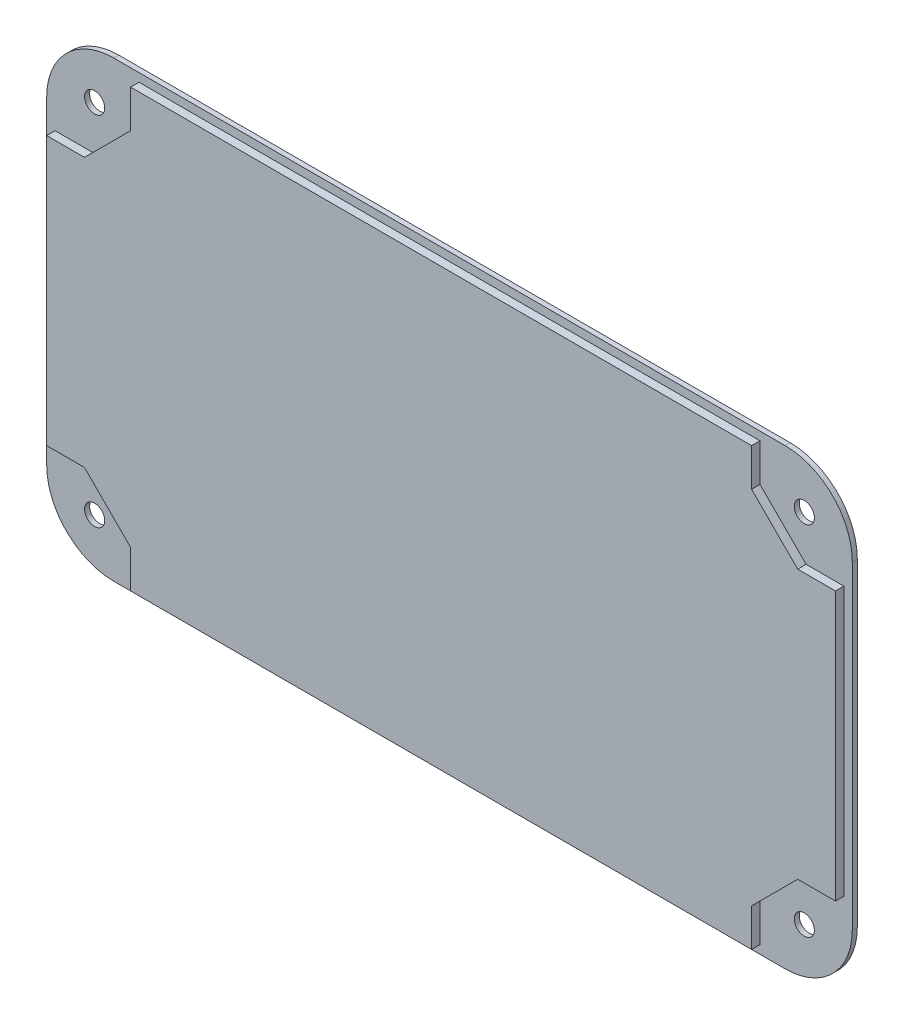
ISO-10303-21;
HEADER;
FILE_DESCRIPTION(('STEP AP214'),'2;1');
FILE_NAME('part.step','',(''),(''),'','','');
FILE_SCHEMA(('AUTOMOTIVE_DESIGN { 1 0 10303 214 1 1 1 1 }'));
ENDSEC;
DATA;
#1=APPLICATION_CONTEXT('core data for automotive mechanical design processes');
#2=APPLICATION_PROTOCOL_DEFINITION('international standard','automotive_design',2000,#1);
#3=PRODUCT_CONTEXT('',#1,'mechanical');
#4=PRODUCT('Part','Part','',(#3));
#5=PRODUCT_RELATED_PRODUCT_CATEGORY('part','',(#4));
#6=PRODUCT_DEFINITION_FORMATION('','',#4);
#7=PRODUCT_DEFINITION_CONTEXT('part definition',#1,'design');
#8=PRODUCT_DEFINITION('design','',#6,#7);
#9=PRODUCT_DEFINITION_SHAPE('','',#8);
#10=(LENGTH_UNIT() NAMED_UNIT(*) SI_UNIT(.MILLI.,.METRE.));
#11=(NAMED_UNIT(*) PLANE_ANGLE_UNIT() SI_UNIT($,.RADIAN.));
#12=(NAMED_UNIT(*) SI_UNIT($,.STERADIAN.) SOLID_ANGLE_UNIT());
#13=UNCERTAINTY_MEASURE_WITH_UNIT(LENGTH_MEASURE(1.E-05),#10,'distance_accuracy_value','');
#14=(GEOMETRIC_REPRESENTATION_CONTEXT(3) GLOBAL_UNCERTAINTY_ASSIGNED_CONTEXT((#13)) GLOBAL_UNIT_ASSIGNED_CONTEXT((#10,
#11,#12)) REPRESENTATION_CONTEXT('',''));
#15=CARTESIAN_POINT('',(0.,0.,0.));
#16=DIRECTION('',(0.,0.,1.));
#17=DIRECTION('',(1.,0.,0.));
#18=AXIS2_PLACEMENT_3D('',#15,#16,#17);
#19=CARTESIAN_POINT('',(100.,-47.5,1.5));
#20=DIRECTION('',(0.,0.,1.));
#21=DIRECTION('',(1.,0.,0.));
#22=AXIS2_PLACEMENT_3D('',#19,#20,#21);
#23=PLANE('',#22);
#24=CARTESIAN_POINT('',(-105.710599836322,53.2105998363216,1.5));
#25=DIRECTION('',(0.,0.,1.));
#26=DIRECTION('',(1.,0.,0.));
#27=AXIS2_PLACEMENT_3D('',#24,#25,#26);
#28=CIRCLE('',#27,3.00000000000001);
#29=CARTESIAN_POINT('',(-102.710599836322,53.2105998363216,1.5));
#30=VERTEX_POINT('',#29);
#31=EDGE_CURVE('E149',#30,#30,#28,.T.);
#32=ORIENTED_EDGE('',*,*,#31,.F.);
#33=EDGE_LOOP('',(#32));
#34=FACE_BOUND('',#33,.T.);
#35=CARTESIAN_POINT('',(-105.710599836322,-53.2105998363216,1.5));
#36=DIRECTION('',(0.,0.,1.));
#37=DIRECTION('',(1.,0.,0.));
#38=AXIS2_PLACEMENT_3D('',#35,#36,#37);
#39=CIRCLE('',#38,3.00000000000002);
#40=CARTESIAN_POINT('',(-102.710599836322,-53.2105998363216,1.5));
#41=VERTEX_POINT('',#40);
#42=EDGE_CURVE('E196',#41,#41,#39,.T.);
#43=ORIENTED_EDGE('',*,*,#42,.F.);
#44=EDGE_LOOP('',(#43));
#45=FACE_BOUND('',#44,.T.);
#46=CARTESIAN_POINT('',(105.710599836322,-53.2105998363216,1.5));
#47=DIRECTION('',(0.,0.,1.));
#48=DIRECTION('',(1.,0.,0.));
#49=AXIS2_PLACEMENT_3D('',#46,#47,#48);
#50=CIRCLE('',#49,3.00000000000004);
#51=CARTESIAN_POINT('',(108.710599836322,-53.2105998363216,1.5));
#52=VERTEX_POINT('',#51);
#53=EDGE_CURVE('E199',#52,#52,#50,.T.);
#54=ORIENTED_EDGE('',*,*,#53,.F.);
#55=EDGE_LOOP('',(#54));
#56=FACE_BOUND('',#55,.T.);
#57=CARTESIAN_POINT('',(105.710599836322,53.2105998363216,1.5));
#58=DIRECTION('',(0.,0.,1.));
#59=DIRECTION('',(1.,0.,0.));
#60=AXIS2_PLACEMENT_3D('',#57,#58,#59);
#61=CIRCLE('',#60,3.00000000000001);
#62=CARTESIAN_POINT('',(108.710599836322,53.2105998363216,1.5));
#63=VERTEX_POINT('',#62);
#64=EDGE_CURVE('E202',#63,#63,#61,.T.);
#65=ORIENTED_EDGE('',*,*,#64,.F.);
#66=EDGE_LOOP('',(#65));
#67=FACE_BOUND('',#66,.T.);
#68=CARTESIAN_POINT('',(100.,-47.5,1.5));
#69=DIRECTION('',(0.,0.,1.));
#70=DIRECTION('',(1.,0.,0.));
#71=AXIS2_PLACEMENT_3D('',#68,#69,#70);
#72=CIRCLE('',#71,20.);
#73=CARTESIAN_POINT('',(99.9999999999998,-67.5,1.5));
#74=VERTEX_POINT('',#73);
#75=CARTESIAN_POINT('',(120.,-47.4999999999999,1.5));
#76=VERTEX_POINT('',#75);
#77=EDGE_CURVE('E161',#74,#76,#72,.T.);
#78=ORIENTED_EDGE('',*,*,#77,.T.);
#79=DIRECTION('',(0.,1.,0.));
#80=VECTOR('',#79,1.);
#81=CARTESIAN_POINT('',(120.,-47.4999999999999,1.5));
#82=LINE('',#81,#80);
#83=CARTESIAN_POINT('',(120.,47.4999999999999,1.5));
#84=VERTEX_POINT('',#83);
#85=EDGE_CURVE('E101',#76,#84,#82,.T.);
#86=ORIENTED_EDGE('',*,*,#85,.T.);
#87=CARTESIAN_POINT('',(100.,47.5,1.5));
#88=DIRECTION('',(0.,0.,1.));
#89=DIRECTION('',(-1.,0.,0.));
#90=AXIS2_PLACEMENT_3D('',#87,#88,#89);
#91=CIRCLE('',#90,20.);
#92=CARTESIAN_POINT('',(99.9999999999998,67.5,1.5));
#93=VERTEX_POINT('',#92);
#94=EDGE_CURVE('E176',#84,#93,#91,.T.);
#95=ORIENTED_EDGE('',*,*,#94,.T.);
#96=DIRECTION('',(-1.,0.,0.));
#97=VECTOR('',#96,1.);
#98=CARTESIAN_POINT('',(-99.9999999999999,67.5,1.5));
#99=LINE('',#98,#97);
#100=CARTESIAN_POINT('',(-99.9999999999999,67.5,1.5));
#101=VERTEX_POINT('',#100);
#102=EDGE_CURVE('E188',#93,#101,#99,.T.);
#103=ORIENTED_EDGE('',*,*,#102,.T.);
#104=CARTESIAN_POINT('',(-100.,47.5,1.5));
#105=DIRECTION('',(0.,0.,1.));
#106=DIRECTION('',(-1.,0.,0.));
#107=AXIS2_PLACEMENT_3D('',#104,#105,#106);
#108=CIRCLE('',#107,20.);
#109=CARTESIAN_POINT('',(-120.,47.4999999999999,1.5));
#110=VERTEX_POINT('',#109);
#111=EDGE_CURVE('E124',#101,#110,#108,.T.);
#112=ORIENTED_EDGE('',*,*,#111,.T.);
#113=DIRECTION('',(0.,-1.,0.));
#114=VECTOR('',#113,1.);
#115=CARTESIAN_POINT('',(-120.,-47.4999999999999,1.5));
#116=LINE('',#115,#114);
#117=CARTESIAN_POINT('',(-120.,-47.5,1.5));
#118=VERTEX_POINT('',#117);
#119=EDGE_CURVE('E117',#110,#118,#116,.T.);
#120=ORIENTED_EDGE('',*,*,#119,.T.);
#121=CARTESIAN_POINT('',(-100.,-47.5,1.5));
#122=DIRECTION('',(0.,0.,1.));
#123=DIRECTION('',(-1.,0.,0.));
#124=AXIS2_PLACEMENT_3D('',#121,#122,#123);
#125=CIRCLE('',#124,20.);
#126=CARTESIAN_POINT('',(-99.9999999999999,-67.5,1.5));
#127=VERTEX_POINT('',#126);
#128=EDGE_CURVE('E121',#118,#127,#125,.T.);
#129=ORIENTED_EDGE('',*,*,#128,.T.);
#130=DIRECTION('',(1.,0.,0.));
#131=VECTOR('',#130,1.);
#132=CARTESIAN_POINT('',(-99.9999999999999,-67.5,1.5));
#133=LINE('',#132,#131);
#134=EDGE_CURVE('E60',#127,#74,#133,.T.);
#135=ORIENTED_EDGE('',*,*,#134,.T.);
#136=EDGE_LOOP('',(#78,#86,#95,#103,#112,#120,#129,#135));
#137=FACE_BOUND('',#136,.T.);
#138=DIRECTION('',(0.,-1.,0.));
#139=VECTOR('',#138,1.);
#140=CARTESIAN_POINT('',(-92.5,0.,1.5));
#141=LINE('',#140,#139);
#142=CARTESIAN_POINT('',(-92.5,-53.75,1.5));
#143=VERTEX_POINT('',#142);
#144=CARTESIAN_POINT('',(-92.5,-65.,1.5));
#145=VERTEX_POINT('',#144);
#146=EDGE_CURVE('E305',#143,#145,#141,.T.);
#147=ORIENTED_EDGE('',*,*,#146,.F.);
#148=DIRECTION('',(0.707106781186547,-0.707106781186548,0.));
#149=VECTOR('',#148,1.);
#150=CARTESIAN_POINT('',(-73.125,-73.125,1.5));
#151=LINE('',#150,#149);
#152=CARTESIAN_POINT('',(-106.25,-40.,1.5));
#153=VERTEX_POINT('',#152);
#154=EDGE_CURVE('E308',#153,#143,#151,.T.);
#155=ORIENTED_EDGE('',*,*,#154,.F.);
#156=DIRECTION('',(1.,0.,0.));
#157=VECTOR('',#156,1.);
#158=CARTESIAN_POINT('',(0.,-40.,1.5));
#159=LINE('',#158,#157);
#160=CARTESIAN_POINT('',(-117.5,-40.,1.5));
#161=VERTEX_POINT('',#160);
#162=EDGE_CURVE('E264',#161,#153,#159,.T.);
#163=ORIENTED_EDGE('',*,*,#162,.F.);
#164=DIRECTION('',(0.,-1.,0.));
#165=VECTOR('',#164,1.);
#166=CARTESIAN_POINT('',(-117.5,0.,1.5));
#167=LINE('',#166,#165);
#168=CARTESIAN_POINT('',(-117.5,40.,1.5));
#169=VERTEX_POINT('',#168);
#170=EDGE_CURVE('E267',#169,#161,#167,.T.);
#171=ORIENTED_EDGE('',*,*,#170,.F.);
#172=DIRECTION('',(-1.,0.,0.));
#173=VECTOR('',#172,1.);
#174=CARTESIAN_POINT('',(0.,40.,1.5));
#175=LINE('',#174,#173);
#176=CARTESIAN_POINT('',(-106.25,40.,1.5));
#177=VERTEX_POINT('',#176);
#178=EDGE_CURVE('E269',#177,#169,#175,.T.);
#179=ORIENTED_EDGE('',*,*,#178,.F.);
#180=DIRECTION('',(-0.707106781186548,-0.707106781186548,0.));
#181=VECTOR('',#180,1.);
#182=CARTESIAN_POINT('',(-73.125,73.125,1.5));
#183=LINE('',#182,#181);
#184=CARTESIAN_POINT('',(-92.5,53.75,1.5));
#185=VERTEX_POINT('',#184);
#186=EDGE_CURVE('E272',#185,#177,#183,.T.);
#187=ORIENTED_EDGE('',*,*,#186,.F.);
#188=DIRECTION('',(0.,-1.,0.));
#189=VECTOR('',#188,1.);
#190=CARTESIAN_POINT('',(-92.5,0.,1.5));
#191=LINE('',#190,#189);
#192=CARTESIAN_POINT('',(-92.5,65.,1.5));
#193=VERTEX_POINT('',#192);
#194=EDGE_CURVE('E275',#193,#185,#191,.T.);
#195=ORIENTED_EDGE('',*,*,#194,.F.);
#196=DIRECTION('',(-1.,0.,0.));
#197=VECTOR('',#196,1.);
#198=CARTESIAN_POINT('',(0.,65.,1.5));
#199=LINE('',#198,#197);
#200=CARTESIAN_POINT('',(92.4999999999999,65.,1.5));
#201=VERTEX_POINT('',#200);
#202=EDGE_CURVE('E278',#201,#193,#199,.T.);
#203=ORIENTED_EDGE('',*,*,#202,.F.);
#204=DIRECTION('',(0.,1.,0.));
#205=VECTOR('',#204,1.);
#206=CARTESIAN_POINT('',(92.4999999999999,0.,1.5));
#207=LINE('',#206,#205);
#208=CARTESIAN_POINT('',(92.4999999999999,53.75,1.5));
#209=VERTEX_POINT('',#208);
#210=EDGE_CURVE('E281',#209,#201,#207,.T.);
#211=ORIENTED_EDGE('',*,*,#210,.F.);
#212=DIRECTION('',(-0.707106781186548,0.707106781186547,0.));
#213=VECTOR('',#212,1.);
#214=CARTESIAN_POINT('',(73.1249999999999,73.125,1.5));
#215=LINE('',#214,#213);
#216=CARTESIAN_POINT('',(106.25,40.,1.5));
#217=VERTEX_POINT('',#216);
#218=EDGE_CURVE('E284',#217,#209,#215,.T.);
#219=ORIENTED_EDGE('',*,*,#218,.F.);
#220=DIRECTION('',(-1.,0.,0.));
#221=VECTOR('',#220,1.);
#222=CARTESIAN_POINT('',(0.,40.0000000000003,1.5));
#223=LINE('',#222,#221);
#224=CARTESIAN_POINT('',(117.5,40.,1.5));
#225=VERTEX_POINT('',#224);
#226=EDGE_CURVE('E287',#225,#217,#223,.T.);
#227=ORIENTED_EDGE('',*,*,#226,.F.);
#228=DIRECTION('',(0.,1.,0.));
#229=VECTOR('',#228,1.);
#230=CARTESIAN_POINT('',(117.5,0.,1.5));
#231=LINE('',#230,#229);
#232=CARTESIAN_POINT('',(117.5,-40.,1.5));
#233=VERTEX_POINT('',#232);
#234=EDGE_CURVE('E290',#233,#225,#231,.T.);
#235=ORIENTED_EDGE('',*,*,#234,.F.);
#236=DIRECTION('',(1.,0.,0.));
#237=VECTOR('',#236,1.);
#238=CARTESIAN_POINT('',(0.,-40.,1.5));
#239=LINE('',#238,#237);
#240=CARTESIAN_POINT('',(106.25,-40.,1.5));
#241=VERTEX_POINT('',#240);
#242=EDGE_CURVE('E293',#241,#233,#239,.T.);
#243=ORIENTED_EDGE('',*,*,#242,.F.);
#244=DIRECTION('',(0.707106781186548,0.707106781186547,0.));
#245=VECTOR('',#244,1.);
#246=CARTESIAN_POINT('',(73.1249999999999,-73.125,1.5));
#247=LINE('',#246,#245);
#248=CARTESIAN_POINT('',(92.4999999999999,-53.75,1.5));
#249=VERTEX_POINT('',#248);
#250=EDGE_CURVE('E296',#249,#241,#247,.T.);
#251=ORIENTED_EDGE('',*,*,#250,.F.);
#252=DIRECTION('',(0.,1.,0.));
#253=VECTOR('',#252,1.);
#254=CARTESIAN_POINT('',(92.4999999999999,0.,1.5));
#255=LINE('',#254,#253);
#256=CARTESIAN_POINT('',(92.4999999999999,-65.,1.5));
#257=VERTEX_POINT('',#256);
#258=EDGE_CURVE('E299',#257,#249,#255,.T.);
#259=ORIENTED_EDGE('',*,*,#258,.F.);
#260=DIRECTION('',(1.,0.,0.));
#261=VECTOR('',#260,1.);
#262=CARTESIAN_POINT('',(0.,-65.,1.5));
#263=LINE('',#262,#261);
#264=EDGE_CURVE('E302',#145,#257,#263,.T.);
#265=ORIENTED_EDGE('',*,*,#264,.F.);
#266=EDGE_LOOP('',(#147,#155,#163,#171,#179,#187,#195,#203,#211,#219,#227,#235,#243,#251,#259,#265));
#267=FACE_BOUND('',#266,.T.);
#268=ADVANCED_FACE('F36',(#34,#45,#56,#67,#137,#267),#23,.T.);
#269=CARTESIAN_POINT('',(100.,-47.5,1.5));
#270=DIRECTION('',(0.,0.,-1.));
#271=DIRECTION('',(-1.,0.,0.));
#272=AXIS2_PLACEMENT_3D('',#269,#270,#271);
#273=CYLINDRICAL_SURFACE('',#272,20.);
#274=CARTESIAN_POINT('',(100.,-47.5,0.));
#275=DIRECTION('',(0.,0.,1.));
#276=DIRECTION('',(1.,0.,0.));
#277=AXIS2_PLACEMENT_3D('',#274,#275,#276);
#278=CIRCLE('',#277,20.);
#279=CARTESIAN_POINT('',(99.9999999999998,-67.5,0.));
#280=VERTEX_POINT('',#279);
#281=CARTESIAN_POINT('',(120.,-47.4999999999999,0.));
#282=VERTEX_POINT('',#281);
#283=EDGE_CURVE('E145',#280,#282,#278,.T.);
#284=ORIENTED_EDGE('',*,*,#283,.T.);
#285=DIRECTION('',(0.,0.,-1.));
#286=VECTOR('',#285,1.);
#287=CARTESIAN_POINT('',(120.,-47.4999999999999,1.5));
#288=LINE('',#287,#286);
#289=EDGE_CURVE('E11',#76,#282,#288,.T.);
#290=ORIENTED_EDGE('',*,*,#289,.F.);
#291=ORIENTED_EDGE('',*,*,#77,.F.);
#292=DIRECTION('',(0.,0.,-1.));
#293=VECTOR('',#292,1.);
#294=CARTESIAN_POINT('',(99.9999999999998,-67.5,1.5));
#295=LINE('',#294,#293);
#296=EDGE_CURVE('E141',#74,#280,#295,.T.);
#297=ORIENTED_EDGE('',*,*,#296,.T.);
#298=EDGE_LOOP('',(#284,#290,#291,#297));
#299=FACE_BOUND('',#298,.T.);
#300=ADVANCED_FACE('F38',(#299),#273,.T.);
#301=CARTESIAN_POINT('',(120.,-47.4999999999999,1.5));
#302=DIRECTION('',(-1.,0.,0.));
#303=DIRECTION('',(0.,0.,1.));
#304=AXIS2_PLACEMENT_3D('',#301,#302,#303);
#305=PLANE('',#304);
#306=DIRECTION('',(0.,1.,0.));
#307=VECTOR('',#306,1.);
#308=CARTESIAN_POINT('',(120.,-47.4999999999999,0.));
#309=LINE('',#308,#307);
#310=CARTESIAN_POINT('',(120.,47.4999999999999,0.));
#311=VERTEX_POINT('',#310);
#312=EDGE_CURVE('E148',#282,#311,#309,.T.);
#313=ORIENTED_EDGE('',*,*,#312,.T.);
#314=DIRECTION('',(0.,0.,-1.));
#315=VECTOR('',#314,1.);
#316=CARTESIAN_POINT('',(120.,47.4999999999999,1.5));
#317=LINE('',#316,#315);
#318=EDGE_CURVE('E44',#84,#311,#317,.T.);
#319=ORIENTED_EDGE('',*,*,#318,.F.);
#320=ORIENTED_EDGE('',*,*,#85,.F.);
#321=ORIENTED_EDGE('',*,*,#289,.T.);
#322=EDGE_LOOP('',(#313,#319,#320,#321));
#323=FACE_BOUND('',#322,.T.);
#324=ADVANCED_FACE('F474',(#323),#305,.F.);
#325=CARTESIAN_POINT('',(100.,47.5,1.5));
#326=DIRECTION('',(0.,0.,-1.));
#327=DIRECTION('',(-1.,0.,0.));
#328=AXIS2_PLACEMENT_3D('',#325,#326,#327);
#329=CYLINDRICAL_SURFACE('',#328,20.);
#330=CARTESIAN_POINT('',(100.,47.5,0.));
#331=DIRECTION('',(0.,0.,1.));
#332=DIRECTION('',(-1.,0.,0.));
#333=AXIS2_PLACEMENT_3D('',#330,#331,#332);
#334=CIRCLE('',#333,20.);
#335=CARTESIAN_POINT('',(99.9999999999998,67.5,0.));
#336=VERTEX_POINT('',#335);
#337=EDGE_CURVE('E151',#311,#336,#334,.T.);
#338=ORIENTED_EDGE('',*,*,#337,.T.);
#339=DIRECTION('',(0.,0.,-1.));
#340=VECTOR('',#339,1.);
#341=CARTESIAN_POINT('',(99.9999999999998,67.5,1.5));
#342=LINE('',#341,#340);
#343=EDGE_CURVE('E168',#93,#336,#342,.T.);
#344=ORIENTED_EDGE('',*,*,#343,.F.);
#345=ORIENTED_EDGE('',*,*,#94,.F.);
#346=ORIENTED_EDGE('',*,*,#318,.T.);
#347=EDGE_LOOP('',(#338,#344,#345,#346));
#348=FACE_BOUND('',#347,.T.);
#349=ADVANCED_FACE('F174',(#348),#329,.T.);
#350=CARTESIAN_POINT('',(-99.9999999999999,67.5,1.5));
#351=DIRECTION('',(0.,-1.,0.));
#352=DIRECTION('',(0.,0.,-1.));
#353=AXIS2_PLACEMENT_3D('',#350,#351,#352);
#354=PLANE('',#353);
#355=DIRECTION('',(-1.,0.,0.));
#356=VECTOR('',#355,1.);
#357=CARTESIAN_POINT('',(-99.9999999999999,67.5,0.));
#358=LINE('',#357,#356);
#359=CARTESIAN_POINT('',(-99.9999999999999,67.5,0.));
#360=VERTEX_POINT('',#359);
#361=EDGE_CURVE('E153',#336,#360,#358,.T.);
#362=ORIENTED_EDGE('',*,*,#361,.T.);
#363=DIRECTION('',(0.,0.,-1.));
#364=VECTOR('',#363,1.);
#365=CARTESIAN_POINT('',(-99.9999999999999,67.5,1.5));
#366=LINE('',#365,#364);
#367=EDGE_CURVE('E165',#101,#360,#366,.T.);
#368=ORIENTED_EDGE('',*,*,#367,.F.);
#369=ORIENTED_EDGE('',*,*,#102,.F.);
#370=ORIENTED_EDGE('',*,*,#343,.T.);
#371=EDGE_LOOP('',(#362,#368,#369,#370));
#372=FACE_BOUND('',#371,.T.);
#373=ADVANCED_FACE('F184',(#372),#354,.F.);
#374=CARTESIAN_POINT('',(-100.,47.5,1.5));
#375=DIRECTION('',(0.,0.,-1.));
#376=DIRECTION('',(-1.,0.,0.));
#377=AXIS2_PLACEMENT_3D('',#374,#375,#376);
#378=CYLINDRICAL_SURFACE('',#377,20.);
#379=CARTESIAN_POINT('',(-100.,47.5,0.));
#380=DIRECTION('',(0.,0.,1.));
#381=DIRECTION('',(-1.,0.,0.));
#382=AXIS2_PLACEMENT_3D('',#379,#380,#381);
#383=CIRCLE('',#382,20.);
#384=CARTESIAN_POINT('',(-120.,47.4999999999999,0.));
#385=VERTEX_POINT('',#384);
#386=EDGE_CURVE('E155',#360,#385,#383,.T.);
#387=ORIENTED_EDGE('',*,*,#386,.T.);
#388=DIRECTION('',(0.,0.,-1.));
#389=VECTOR('',#388,1.);
#390=CARTESIAN_POINT('',(-120.,47.4999999999999,1.5));
#391=LINE('',#390,#389);
#392=EDGE_CURVE('E136',#110,#385,#391,.T.);
#393=ORIENTED_EDGE('',*,*,#392,.F.);
#394=ORIENTED_EDGE('',*,*,#111,.F.);
#395=ORIENTED_EDGE('',*,*,#367,.T.);
#396=EDGE_LOOP('',(#387,#393,#394,#395));
#397=FACE_BOUND('',#396,.T.);
#398=ADVANCED_FACE('F187',(#397),#378,.T.);
#399=CARTESIAN_POINT('',(-120.,-47.4999999999999,1.5));
#400=DIRECTION('',(1.,0.,0.));
#401=DIRECTION('',(0.,0.,-1.));
#402=AXIS2_PLACEMENT_3D('',#399,#400,#401);
#403=PLANE('',#402);
#404=DIRECTION('',(0.,-1.,0.));
#405=VECTOR('',#404,1.);
#406=CARTESIAN_POINT('',(-120.,-47.4999999999999,0.));
#407=LINE('',#406,#405);
#408=CARTESIAN_POINT('',(-120.,-47.5,0.));
#409=VERTEX_POINT('',#408);
#410=EDGE_CURVE('E133',#385,#409,#407,.T.);
#411=ORIENTED_EDGE('',*,*,#410,.T.);
#412=DIRECTION('',(0.,0.,-1.));
#413=VECTOR('',#412,1.);
#414=CARTESIAN_POINT('',(-120.,-47.5,1.5));
#415=LINE('',#414,#413);
#416=EDGE_CURVE('E130',#118,#409,#415,.T.);
#417=ORIENTED_EDGE('',*,*,#416,.F.);
#418=ORIENTED_EDGE('',*,*,#119,.F.);
#419=ORIENTED_EDGE('',*,*,#392,.T.);
#420=EDGE_LOOP('',(#411,#417,#418,#419));
#421=FACE_BOUND('',#420,.T.);
#422=ADVANCED_FACE('F131',(#421),#403,.F.);
#423=CARTESIAN_POINT('',(-100.,-47.5,1.5));
#424=DIRECTION('',(0.,0.,-1.));
#425=DIRECTION('',(-1.,0.,0.));
#426=AXIS2_PLACEMENT_3D('',#423,#424,#425);
#427=CYLINDRICAL_SURFACE('',#426,20.);
#428=CARTESIAN_POINT('',(-100.,-47.5,0.));
#429=DIRECTION('',(0.,0.,1.));
#430=DIRECTION('',(-1.,0.,0.));
#431=AXIS2_PLACEMENT_3D('',#428,#429,#430);
#432=CIRCLE('',#431,20.);
#433=CARTESIAN_POINT('',(-99.9999999999999,-67.5,0.));
#434=VERTEX_POINT('',#433);
#435=EDGE_CURVE('E158',#409,#434,#432,.T.);
#436=ORIENTED_EDGE('',*,*,#435,.T.);
#437=DIRECTION('',(0.,0.,-1.));
#438=VECTOR('',#437,1.);
#439=CARTESIAN_POINT('',(-99.9999999999999,-67.5,1.5));
#440=LINE('',#439,#438);
#441=EDGE_CURVE('E137',#127,#434,#440,.T.);
#442=ORIENTED_EDGE('',*,*,#441,.F.);
#443=ORIENTED_EDGE('',*,*,#128,.F.);
#444=ORIENTED_EDGE('',*,*,#416,.T.);
#445=EDGE_LOOP('',(#436,#442,#443,#444));
#446=FACE_BOUND('',#445,.T.);
#447=ADVANCED_FACE('F139',(#446),#427,.T.);
#448=CARTESIAN_POINT('',(-99.9999999999999,-67.5,1.5));
#449=DIRECTION('',(0.,1.,0.));
#450=DIRECTION('',(0.,0.,1.));
#451=AXIS2_PLACEMENT_3D('',#448,#449,#450);
#452=PLANE('',#451);
#453=DIRECTION('',(1.,0.,0.));
#454=VECTOR('',#453,1.);
#455=CARTESIAN_POINT('',(-99.9999999999999,-67.5,0.));
#456=LINE('',#455,#454);
#457=EDGE_CURVE('E93',#434,#280,#456,.T.);
#458=ORIENTED_EDGE('',*,*,#457,.T.);
#459=ORIENTED_EDGE('',*,*,#296,.F.);
#460=ORIENTED_EDGE('',*,*,#134,.F.);
#461=ORIENTED_EDGE('',*,*,#441,.T.);
#462=EDGE_LOOP('',(#458,#459,#460,#461));
#463=FACE_BOUND('',#462,.T.);
#464=ADVANCED_FACE('F484',(#463),#452,.F.);
#465=CARTESIAN_POINT('',(100.,-47.5,0.));
#466=DIRECTION('',(0.,0.,1.));
#467=DIRECTION('',(1.,0.,0.));
#468=AXIS2_PLACEMENT_3D('',#465,#466,#467);
#469=PLANE('',#468);
#470=CARTESIAN_POINT('',(-105.710599836322,53.2105998363216,0.));
#471=DIRECTION('',(0.,0.,1.));
#472=DIRECTION('',(1.,0.,0.));
#473=AXIS2_PLACEMENT_3D('',#470,#471,#472);
#474=CIRCLE('',#473,3.00000000000001);
#475=CARTESIAN_POINT('',(-102.710599836322,53.2105998363216,0.));
#476=VERTEX_POINT('',#475);
#477=EDGE_CURVE('E209',#476,#476,#474,.T.);
#478=ORIENTED_EDGE('',*,*,#477,.T.);
#479=EDGE_LOOP('',(#478));
#480=FACE_BOUND('',#479,.T.);
#481=CARTESIAN_POINT('',(-105.710599836322,-53.2105998363216,0.));
#482=DIRECTION('',(0.,0.,1.));
#483=DIRECTION('',(1.,0.,0.));
#484=AXIS2_PLACEMENT_3D('',#481,#482,#483);
#485=CIRCLE('',#484,3.00000000000002);
#486=CARTESIAN_POINT('',(-102.710599836322,-53.2105998363216,0.));
#487=VERTEX_POINT('',#486);
#488=EDGE_CURVE('E212',#487,#487,#485,.T.);
#489=ORIENTED_EDGE('',*,*,#488,.T.);
#490=EDGE_LOOP('',(#489));
#491=FACE_BOUND('',#490,.T.);
#492=CARTESIAN_POINT('',(105.710599836322,-53.2105998363216,0.));
#493=DIRECTION('',(0.,0.,1.));
#494=DIRECTION('',(1.,0.,0.));
#495=AXIS2_PLACEMENT_3D('',#492,#493,#494);
#496=CIRCLE('',#495,3.00000000000004);
#497=CARTESIAN_POINT('',(108.710599836322,-53.2105998363216,0.));
#498=VERTEX_POINT('',#497);
#499=EDGE_CURVE('E208',#498,#498,#496,.T.);
#500=ORIENTED_EDGE('',*,*,#499,.T.);
#501=EDGE_LOOP('',(#500));
#502=FACE_BOUND('',#501,.T.);
#503=CARTESIAN_POINT('',(105.710599836322,53.2105998363216,0.));
#504=DIRECTION('',(0.,0.,1.));
#505=DIRECTION('',(1.,0.,0.));
#506=AXIS2_PLACEMENT_3D('',#503,#504,#505);
#507=CIRCLE('',#506,3.00000000000001);
#508=CARTESIAN_POINT('',(108.710599836322,53.2105998363216,0.));
#509=VERTEX_POINT('',#508);
#510=EDGE_CURVE('E205',#509,#509,#507,.T.);
#511=ORIENTED_EDGE('',*,*,#510,.T.);
#512=EDGE_LOOP('',(#511));
#513=FACE_BOUND('',#512,.T.);
#514=ORIENTED_EDGE('',*,*,#283,.F.);
#515=ORIENTED_EDGE('',*,*,#457,.F.);
#516=ORIENTED_EDGE('',*,*,#435,.F.);
#517=ORIENTED_EDGE('',*,*,#410,.F.);
#518=ORIENTED_EDGE('',*,*,#386,.F.);
#519=ORIENTED_EDGE('',*,*,#361,.F.);
#520=ORIENTED_EDGE('',*,*,#337,.F.);
#521=ORIENTED_EDGE('',*,*,#312,.F.);
#522=EDGE_LOOP('',(#514,#515,#516,#517,#518,#519,#520,#521));
#523=FACE_BOUND('',#522,.T.);
#524=ADVANCED_FACE('F180',(#480,#491,#502,#513,#523),#469,.F.);
#525=CARTESIAN_POINT('',(105.710599836322,53.2105998363216,0.));
#526=DIRECTION('',(0.,0.,1.));
#527=DIRECTION('',(1.,0.,0.));
#528=AXIS2_PLACEMENT_3D('',#525,#526,#527);
#529=CYLINDRICAL_SURFACE('',#528,3.00000000000001);
#530=ORIENTED_EDGE('',*,*,#64,.T.);
#531=EDGE_LOOP('',(#530));
#532=FACE_BOUND('',#531,.T.);
#533=ORIENTED_EDGE('',*,*,#510,.F.);
#534=EDGE_LOOP('',(#533));
#535=FACE_BOUND('',#534,.T.);
#536=ADVANCED_FACE('F480',(#532,#535),#529,.F.);
#537=CARTESIAN_POINT('',(105.710599836322,-53.2105998363216,0.));
#538=DIRECTION('',(0.,0.,1.));
#539=DIRECTION('',(1.,0.,0.));
#540=AXIS2_PLACEMENT_3D('',#537,#538,#539);
#541=CYLINDRICAL_SURFACE('',#540,3.00000000000004);
#542=ORIENTED_EDGE('',*,*,#53,.T.);
#543=EDGE_LOOP('',(#542));
#544=FACE_BOUND('',#543,.T.);
#545=ORIENTED_EDGE('',*,*,#499,.F.);
#546=EDGE_LOOP('',(#545));
#547=FACE_BOUND('',#546,.T.);
#548=ADVANCED_FACE('F538',(#544,#547),#541,.F.);
#549=CARTESIAN_POINT('',(-105.710599836322,-53.2105998363216,0.));
#550=DIRECTION('',(0.,0.,1.));
#551=DIRECTION('',(1.,0.,0.));
#552=AXIS2_PLACEMENT_3D('',#549,#550,#551);
#553=CYLINDRICAL_SURFACE('',#552,3.00000000000002);
#554=ORIENTED_EDGE('',*,*,#42,.T.);
#555=EDGE_LOOP('',(#554));
#556=FACE_BOUND('',#555,.T.);
#557=ORIENTED_EDGE('',*,*,#488,.F.);
#558=EDGE_LOOP('',(#557));
#559=FACE_BOUND('',#558,.T.);
#560=ADVANCED_FACE('F545',(#556,#559),#553,.F.);
#561=CARTESIAN_POINT('',(-105.710599836322,53.2105998363216,0.));
#562=DIRECTION('',(0.,0.,1.));
#563=DIRECTION('',(1.,0.,0.));
#564=AXIS2_PLACEMENT_3D('',#561,#562,#563);
#565=CYLINDRICAL_SURFACE('',#564,3.00000000000001);
#566=ORIENTED_EDGE('',*,*,#31,.T.);
#567=EDGE_LOOP('',(#566));
#568=FACE_BOUND('',#567,.T.);
#569=ORIENTED_EDGE('',*,*,#477,.F.);
#570=EDGE_LOOP('',(#569));
#571=FACE_BOUND('',#570,.T.);
#572=ADVANCED_FACE('F553',(#568,#571),#565,.F.);
#573=CARTESIAN_POINT('',(-73.125,-73.125,4.));
#574=DIRECTION('',(0.707106781186548,0.707106781186547,0.));
#575=DIRECTION('',(-0.707106781186547,0.707106781186548,0.));
#576=AXIS2_PLACEMENT_3D('',#573,#574,#575);
#577=PLANE('',#576);
#578=ORIENTED_EDGE('',*,*,#154,.T.);
#579=DIRECTION('',(0.,0.,-1.));
#580=VECTOR('',#579,1.);
#581=CARTESIAN_POINT('',(-92.5,-53.75,4.));
#582=LINE('',#581,#580);
#583=CARTESIAN_POINT('',(-92.5,-53.75,4.));
#584=VERTEX_POINT('',#583);
#585=EDGE_CURVE('E213',#584,#143,#582,.T.);
#586=ORIENTED_EDGE('',*,*,#585,.F.);
#587=DIRECTION('',(0.707106781186547,-0.707106781186548,0.));
#588=VECTOR('',#587,1.);
#589=CARTESIAN_POINT('',(-73.125,-73.125,4.));
#590=LINE('',#589,#588);
#591=CARTESIAN_POINT('',(-106.25,-40.,4.));
#592=VERTEX_POINT('',#591);
#593=EDGE_CURVE('E266',#592,#584,#590,.T.);
#594=ORIENTED_EDGE('',*,*,#593,.F.);
#595=DIRECTION('',(0.,0.,-1.));
#596=VECTOR('',#595,1.);
#597=CARTESIAN_POINT('',(-106.25,-40.,4.));
#598=LINE('',#597,#596);
#599=EDGE_CURVE('E260',#592,#153,#598,.T.);
#600=ORIENTED_EDGE('',*,*,#599,.T.);
#601=EDGE_LOOP('',(#578,#586,#594,#600));
#602=FACE_BOUND('',#601,.T.);
#603=ADVANCED_FACE('F367',(#602),#577,.F.);
#604=CARTESIAN_POINT('',(-92.5,0.,4.));
#605=DIRECTION('',(1.,0.,0.));
#606=DIRECTION('',(0.,0.,-1.));
#607=AXIS2_PLACEMENT_3D('',#604,#605,#606);
#608=PLANE('',#607);
#609=ORIENTED_EDGE('',*,*,#146,.T.);
#610=DIRECTION('',(0.,0.,-1.));
#611=VECTOR('',#610,1.);
#612=CARTESIAN_POINT('',(-92.5,-65.,4.));
#613=LINE('',#612,#611);
#614=CARTESIAN_POINT('',(-92.5,-65.,4.));
#615=VERTEX_POINT('',#614);
#616=EDGE_CURVE('E220',#615,#145,#613,.T.);
#617=ORIENTED_EDGE('',*,*,#616,.F.);
#618=DIRECTION('',(0.,-1.,0.));
#619=VECTOR('',#618,1.);
#620=CARTESIAN_POINT('',(-92.5,0.,4.));
#621=LINE('',#620,#619);
#622=EDGE_CURVE('E352',#584,#615,#621,.T.);
#623=ORIENTED_EDGE('',*,*,#622,.F.);
#624=ORIENTED_EDGE('',*,*,#585,.T.);
#625=EDGE_LOOP('',(#609,#617,#623,#624));
#626=FACE_BOUND('',#625,.T.);
#627=ADVANCED_FACE('F372',(#626),#608,.F.);
#628=CARTESIAN_POINT('',(0.,-65.,4.));
#629=DIRECTION('',(0.,1.,0.));
#630=DIRECTION('',(0.,0.,1.));
#631=AXIS2_PLACEMENT_3D('',#628,#629,#630);
#632=PLANE('',#631);
#633=ORIENTED_EDGE('',*,*,#264,.T.);
#634=DIRECTION('',(0.,0.,-1.));
#635=VECTOR('',#634,1.);
#636=CARTESIAN_POINT('',(92.4999999999999,-65.,4.));
#637=LINE('',#636,#635);
#638=CARTESIAN_POINT('',(92.4999999999999,-65.,4.));
#639=VERTEX_POINT('',#638);
#640=EDGE_CURVE('E223',#639,#257,#637,.T.);
#641=ORIENTED_EDGE('',*,*,#640,.F.);
#642=DIRECTION('',(1.,0.,0.));
#643=VECTOR('',#642,1.);
#644=CARTESIAN_POINT('',(0.,-65.,4.));
#645=LINE('',#644,#643);
#646=EDGE_CURVE('E349',#615,#639,#645,.T.);
#647=ORIENTED_EDGE('',*,*,#646,.F.);
#648=ORIENTED_EDGE('',*,*,#616,.T.);
#649=EDGE_LOOP('',(#633,#641,#647,#648));
#650=FACE_BOUND('',#649,.T.);
#651=ADVANCED_FACE('F412',(#650),#632,.F.);
#652=CARTESIAN_POINT('',(92.4999999999999,0.,4.));
#653=DIRECTION('',(-1.,0.,0.));
#654=DIRECTION('',(0.,0.,1.));
#655=AXIS2_PLACEMENT_3D('',#652,#653,#654);
#656=PLANE('',#655);
#657=ORIENTED_EDGE('',*,*,#258,.T.);
#658=DIRECTION('',(0.,0.,-1.));
#659=VECTOR('',#658,1.);
#660=CARTESIAN_POINT('',(92.4999999999999,-53.75,4.));
#661=LINE('',#660,#659);
#662=CARTESIAN_POINT('',(92.4999999999999,-53.75,4.));
#663=VERTEX_POINT('',#662);
#664=EDGE_CURVE('E226',#663,#249,#661,.T.);
#665=ORIENTED_EDGE('',*,*,#664,.F.);
#666=DIRECTION('',(0.,1.,0.));
#667=VECTOR('',#666,1.);
#668=CARTESIAN_POINT('',(92.4999999999999,0.,4.));
#669=LINE('',#668,#667);
#670=EDGE_CURVE('E346',#639,#663,#669,.T.);
#671=ORIENTED_EDGE('',*,*,#670,.F.);
#672=ORIENTED_EDGE('',*,*,#640,.T.);
#673=EDGE_LOOP('',(#657,#665,#671,#672));
#674=FACE_BOUND('',#673,.T.);
#675=ADVANCED_FACE('F417',(#674),#656,.F.);
#676=CARTESIAN_POINT('',(73.1249999999999,-73.125,4.));
#677=DIRECTION('',(-0.707106781186547,0.707106781186548,0.));
#678=DIRECTION('',(-0.707106781186548,-0.707106781186547,0.));
#679=AXIS2_PLACEMENT_3D('',#676,#677,#678);
#680=PLANE('',#679);
#681=ORIENTED_EDGE('',*,*,#250,.T.);
#682=DIRECTION('',(0.,0.,-1.));
#683=VECTOR('',#682,1.);
#684=CARTESIAN_POINT('',(106.25,-40.,4.));
#685=LINE('',#684,#683);
#686=CARTESIAN_POINT('',(106.25,-40.,4.));
#687=VERTEX_POINT('',#686);
#688=EDGE_CURVE('E229',#687,#241,#685,.T.);
#689=ORIENTED_EDGE('',*,*,#688,.F.);
#690=DIRECTION('',(0.707106781186548,0.707106781186547,0.));
#691=VECTOR('',#690,1.);
#692=CARTESIAN_POINT('',(73.1249999999999,-73.125,4.));
#693=LINE('',#692,#691);
#694=EDGE_CURVE('E343',#663,#687,#693,.T.);
#695=ORIENTED_EDGE('',*,*,#694,.F.);
#696=ORIENTED_EDGE('',*,*,#664,.T.);
#697=EDGE_LOOP('',(#681,#689,#695,#696));
#698=FACE_BOUND('',#697,.T.);
#699=ADVANCED_FACE('F585',(#698),#680,.F.);
#700=CARTESIAN_POINT('',(0.,-40.,4.));
#701=DIRECTION('',(0.,1.,0.));
#702=DIRECTION('',(0.,0.,1.));
#703=AXIS2_PLACEMENT_3D('',#700,#701,#702);
#704=PLANE('',#703);
#705=ORIENTED_EDGE('',*,*,#242,.T.);
#706=DIRECTION('',(0.,0.,-1.));
#707=VECTOR('',#706,1.);
#708=CARTESIAN_POINT('',(117.5,-40.,4.));
#709=LINE('',#708,#707);
#710=CARTESIAN_POINT('',(117.5,-40.,4.));
#711=VERTEX_POINT('',#710);
#712=EDGE_CURVE('E232',#711,#233,#709,.T.);
#713=ORIENTED_EDGE('',*,*,#712,.F.);
#714=DIRECTION('',(1.,0.,0.));
#715=VECTOR('',#714,1.);
#716=CARTESIAN_POINT('',(0.,-40.,4.));
#717=LINE('',#716,#715);
#718=EDGE_CURVE('E340',#687,#711,#717,.T.);
#719=ORIENTED_EDGE('',*,*,#718,.F.);
#720=ORIENTED_EDGE('',*,*,#688,.T.);
#721=EDGE_LOOP('',(#705,#713,#719,#720));
#722=FACE_BOUND('',#721,.T.);
#723=ADVANCED_FACE('F592',(#722),#704,.F.);
#724=CARTESIAN_POINT('',(117.5,0.,4.));
#725=DIRECTION('',(-1.,0.,0.));
#726=DIRECTION('',(0.,0.,1.));
#727=AXIS2_PLACEMENT_3D('',#724,#725,#726);
#728=PLANE('',#727);
#729=ORIENTED_EDGE('',*,*,#234,.T.);
#730=DIRECTION('',(0.,0.,-1.));
#731=VECTOR('',#730,1.);
#732=CARTESIAN_POINT('',(117.5,40.,4.));
#733=LINE('',#732,#731);
#734=CARTESIAN_POINT('',(117.5,40.,4.));
#735=VERTEX_POINT('',#734);
#736=EDGE_CURVE('E235',#735,#225,#733,.T.);
#737=ORIENTED_EDGE('',*,*,#736,.F.);
#738=DIRECTION('',(0.,1.,0.));
#739=VECTOR('',#738,1.);
#740=CARTESIAN_POINT('',(117.5,0.,4.));
#741=LINE('',#740,#739);
#742=EDGE_CURVE('E337',#711,#735,#741,.T.);
#743=ORIENTED_EDGE('',*,*,#742,.F.);
#744=ORIENTED_EDGE('',*,*,#712,.T.);
#745=EDGE_LOOP('',(#729,#737,#743,#744));
#746=FACE_BOUND('',#745,.T.);
#747=ADVANCED_FACE('F600',(#746),#728,.F.);
#748=CARTESIAN_POINT('',(0.,40.0000000000003,4.));
#749=DIRECTION('',(0.,-1.,0.));
#750=DIRECTION('',(1.,0.,0.));
#751=AXIS2_PLACEMENT_3D('',#748,#749,#750);
#752=PLANE('',#751);
#753=ORIENTED_EDGE('',*,*,#226,.T.);
#754=DIRECTION('',(0.,0.,-1.));
#755=VECTOR('',#754,1.);
#756=CARTESIAN_POINT('',(106.25,40.,4.));
#757=LINE('',#756,#755);
#758=CARTESIAN_POINT('',(106.25,40.,4.));
#759=VERTEX_POINT('',#758);
#760=EDGE_CURVE('E238',#759,#217,#757,.T.);
#761=ORIENTED_EDGE('',*,*,#760,.F.);
#762=DIRECTION('',(-1.,0.,0.));
#763=VECTOR('',#762,1.);
#764=CARTESIAN_POINT('',(0.,40.0000000000003,4.));
#765=LINE('',#764,#763);
#766=EDGE_CURVE('E334',#735,#759,#765,.T.);
#767=ORIENTED_EDGE('',*,*,#766,.F.);
#768=ORIENTED_EDGE('',*,*,#736,.T.);
#769=EDGE_LOOP('',(#753,#761,#767,#768));
#770=FACE_BOUND('',#769,.T.);
#771=ADVANCED_FACE('F608',(#770),#752,.F.);
#772=CARTESIAN_POINT('',(73.1249999999999,73.125,4.));
#773=DIRECTION('',(-0.707106781186547,-0.707106781186548,0.));
#774=DIRECTION('',(0.707106781186548,-0.707106781186547,0.));
#775=AXIS2_PLACEMENT_3D('',#772,#773,#774);
#776=PLANE('',#775);
#777=ORIENTED_EDGE('',*,*,#218,.T.);
#778=DIRECTION('',(0.,0.,-1.));
#779=VECTOR('',#778,1.);
#780=CARTESIAN_POINT('',(92.4999999999999,53.75,4.));
#781=LINE('',#780,#779);
#782=CARTESIAN_POINT('',(92.4999999999999,53.75,4.));
#783=VERTEX_POINT('',#782);
#784=EDGE_CURVE('E241',#783,#209,#781,.T.);
#785=ORIENTED_EDGE('',*,*,#784,.F.);
#786=DIRECTION('',(-0.707106781186548,0.707106781186547,0.));
#787=VECTOR('',#786,1.);
#788=CARTESIAN_POINT('',(73.1249999999999,73.125,4.));
#789=LINE('',#788,#787);
#790=EDGE_CURVE('E331',#759,#783,#789,.T.);
#791=ORIENTED_EDGE('',*,*,#790,.F.);
#792=ORIENTED_EDGE('',*,*,#760,.T.);
#793=EDGE_LOOP('',(#777,#785,#791,#792));
#794=FACE_BOUND('',#793,.T.);
#795=ADVANCED_FACE('F616',(#794),#776,.F.);
#796=CARTESIAN_POINT('',(92.4999999999999,0.,4.));
#797=DIRECTION('',(-1.,0.,0.));
#798=DIRECTION('',(0.,0.,1.));
#799=AXIS2_PLACEMENT_3D('',#796,#797,#798);
#800=PLANE('',#799);
#801=ORIENTED_EDGE('',*,*,#210,.T.);
#802=DIRECTION('',(0.,0.,-1.));
#803=VECTOR('',#802,1.);
#804=CARTESIAN_POINT('',(92.4999999999999,65.,4.));
#805=LINE('',#804,#803);
#806=CARTESIAN_POINT('',(92.4999999999999,65.,4.));
#807=VERTEX_POINT('',#806);
#808=EDGE_CURVE('E244',#807,#201,#805,.T.);
#809=ORIENTED_EDGE('',*,*,#808,.F.);
#810=DIRECTION('',(0.,1.,0.));
#811=VECTOR('',#810,1.);
#812=CARTESIAN_POINT('',(92.4999999999999,0.,4.));
#813=LINE('',#812,#811);
#814=EDGE_CURVE('E328',#783,#807,#813,.T.);
#815=ORIENTED_EDGE('',*,*,#814,.F.);
#816=ORIENTED_EDGE('',*,*,#784,.T.);
#817=EDGE_LOOP('',(#801,#809,#815,#816));
#818=FACE_BOUND('',#817,.T.);
#819=ADVANCED_FACE('F624',(#818),#800,.F.);
#820=CARTESIAN_POINT('',(0.,65.,4.));
#821=DIRECTION('',(0.,-1.,0.));
#822=DIRECTION('',(0.,0.,-1.));
#823=AXIS2_PLACEMENT_3D('',#820,#821,#822);
#824=PLANE('',#823);
#825=ORIENTED_EDGE('',*,*,#202,.T.);
#826=DIRECTION('',(0.,0.,-1.));
#827=VECTOR('',#826,1.);
#828=CARTESIAN_POINT('',(-92.5,65.,4.));
#829=LINE('',#828,#827);
#830=CARTESIAN_POINT('',(-92.5,65.,4.));
#831=VERTEX_POINT('',#830);
#832=EDGE_CURVE('E247',#831,#193,#829,.T.);
#833=ORIENTED_EDGE('',*,*,#832,.F.);
#834=DIRECTION('',(-1.,0.,0.));
#835=VECTOR('',#834,1.);
#836=CARTESIAN_POINT('',(0.,65.,4.));
#837=LINE('',#836,#835);
#838=EDGE_CURVE('E325',#807,#831,#837,.T.);
#839=ORIENTED_EDGE('',*,*,#838,.F.);
#840=ORIENTED_EDGE('',*,*,#808,.T.);
#841=EDGE_LOOP('',(#825,#833,#839,#840));
#842=FACE_BOUND('',#841,.T.);
#843=ADVANCED_FACE('F632',(#842),#824,.F.);
#844=CARTESIAN_POINT('',(-92.5,0.,4.));
#845=DIRECTION('',(1.,0.,0.));
#846=DIRECTION('',(0.,0.,-1.));
#847=AXIS2_PLACEMENT_3D('',#844,#845,#846);
#848=PLANE('',#847);
#849=ORIENTED_EDGE('',*,*,#194,.T.);
#850=DIRECTION('',(0.,0.,-1.));
#851=VECTOR('',#850,1.);
#852=CARTESIAN_POINT('',(-92.5,53.75,4.));
#853=LINE('',#852,#851);
#854=CARTESIAN_POINT('',(-92.5,53.75,4.));
#855=VERTEX_POINT('',#854);
#856=EDGE_CURVE('E250',#855,#185,#853,.T.);
#857=ORIENTED_EDGE('',*,*,#856,.F.);
#858=DIRECTION('',(0.,-1.,0.));
#859=VECTOR('',#858,1.);
#860=CARTESIAN_POINT('',(-92.5,0.,4.));
#861=LINE('',#860,#859);
#862=EDGE_CURVE('E322',#831,#855,#861,.T.);
#863=ORIENTED_EDGE('',*,*,#862,.F.);
#864=ORIENTED_EDGE('',*,*,#832,.T.);
#865=EDGE_LOOP('',(#849,#857,#863,#864));
#866=FACE_BOUND('',#865,.T.);
#867=ADVANCED_FACE('F466',(#866),#848,.F.);
#868=CARTESIAN_POINT('',(-73.125,73.125,4.));
#869=DIRECTION('',(0.707106781186548,-0.707106781186548,0.));
#870=DIRECTION('',(0.707106781186548,0.707106781186548,0.));
#871=AXIS2_PLACEMENT_3D('',#868,#869,#870);
#872=PLANE('',#871);
#873=ORIENTED_EDGE('',*,*,#186,.T.);
#874=DIRECTION('',(0.,0.,-1.));
#875=VECTOR('',#874,1.);
#876=CARTESIAN_POINT('',(-106.25,40.,4.));
#877=LINE('',#876,#875);
#878=CARTESIAN_POINT('',(-106.25,40.,4.));
#879=VERTEX_POINT('',#878);
#880=EDGE_CURVE('E253',#879,#177,#877,.T.);
#881=ORIENTED_EDGE('',*,*,#880,.F.);
#882=DIRECTION('',(-0.707106781186548,-0.707106781186548,0.));
#883=VECTOR('',#882,1.);
#884=CARTESIAN_POINT('',(-73.125,73.125,4.));
#885=LINE('',#884,#883);
#886=EDGE_CURVE('E319',#855,#879,#885,.T.);
#887=ORIENTED_EDGE('',*,*,#886,.F.);
#888=ORIENTED_EDGE('',*,*,#856,.T.);
#889=EDGE_LOOP('',(#873,#881,#887,#888));
#890=FACE_BOUND('',#889,.T.);
#891=ADVANCED_FACE('F455',(#890),#872,.F.);
#892=CARTESIAN_POINT('',(0.,40.,4.));
#893=DIRECTION('',(0.,-1.,0.));
#894=DIRECTION('',(0.,0.,-1.));
#895=AXIS2_PLACEMENT_3D('',#892,#893,#894);
#896=PLANE('',#895);
#897=ORIENTED_EDGE('',*,*,#178,.T.);
#898=DIRECTION('',(0.,0.,-1.));
#899=VECTOR('',#898,1.);
#900=CARTESIAN_POINT('',(-117.5,40.,4.));
#901=LINE('',#900,#899);
#902=CARTESIAN_POINT('',(-117.5,40.,4.));
#903=VERTEX_POINT('',#902);
#904=EDGE_CURVE('E256',#903,#169,#901,.T.);
#905=ORIENTED_EDGE('',*,*,#904,.F.);
#906=DIRECTION('',(-1.,0.,0.));
#907=VECTOR('',#906,1.);
#908=CARTESIAN_POINT('',(0.,40.,4.));
#909=LINE('',#908,#907);
#910=EDGE_CURVE('E316',#879,#903,#909,.T.);
#911=ORIENTED_EDGE('',*,*,#910,.F.);
#912=ORIENTED_EDGE('',*,*,#880,.T.);
#913=EDGE_LOOP('',(#897,#905,#911,#912));
#914=FACE_BOUND('',#913,.T.);
#915=ADVANCED_FACE('F458',(#914),#896,.F.);
#916=CARTESIAN_POINT('',(-117.5,0.,4.));
#917=DIRECTION('',(1.,0.,0.));
#918=DIRECTION('',(0.,0.,-1.));
#919=AXIS2_PLACEMENT_3D('',#916,#917,#918);
#920=PLANE('',#919);
#921=ORIENTED_EDGE('',*,*,#170,.T.);
#922=DIRECTION('',(0.,0.,-1.));
#923=VECTOR('',#922,1.);
#924=CARTESIAN_POINT('',(-117.5,-40.,4.));
#925=LINE('',#924,#923);
#926=CARTESIAN_POINT('',(-117.5,-40.,4.));
#927=VERTEX_POINT('',#926);
#928=EDGE_CURVE('E51',#927,#161,#925,.T.);
#929=ORIENTED_EDGE('',*,*,#928,.F.);
#930=DIRECTION('',(0.,-1.,0.));
#931=VECTOR('',#930,1.);
#932=CARTESIAN_POINT('',(-117.5,0.,4.));
#933=LINE('',#932,#931);
#934=EDGE_CURVE('E313',#903,#927,#933,.T.);
#935=ORIENTED_EDGE('',*,*,#934,.F.);
#936=ORIENTED_EDGE('',*,*,#904,.T.);
#937=EDGE_LOOP('',(#921,#929,#935,#936));
#938=FACE_BOUND('',#937,.T.);
#939=ADVANCED_FACE('F449',(#938),#920,.F.);
#940=CARTESIAN_POINT('',(0.,-40.,4.));
#941=DIRECTION('',(0.,1.,0.));
#942=DIRECTION('',(0.,0.,1.));
#943=AXIS2_PLACEMENT_3D('',#940,#941,#942);
#944=PLANE('',#943);
#945=ORIENTED_EDGE('',*,*,#162,.T.);
#946=ORIENTED_EDGE('',*,*,#599,.F.);
#947=DIRECTION('',(1.,0.,0.));
#948=VECTOR('',#947,1.);
#949=CARTESIAN_POINT('',(0.,-40.,4.));
#950=LINE('',#949,#948);
#951=EDGE_CURVE('E263',#927,#592,#950,.T.);
#952=ORIENTED_EDGE('',*,*,#951,.F.);
#953=ORIENTED_EDGE('',*,*,#928,.T.);
#954=EDGE_LOOP('',(#945,#946,#952,#953));
#955=FACE_BOUND('',#954,.T.);
#956=ADVANCED_FACE('F405',(#955),#944,.F.);
#957=CARTESIAN_POINT('',(0.,0.,4.));
#958=DIRECTION('',(0.,0.,1.));
#959=DIRECTION('',(1.,0.,0.));
#960=AXIS2_PLACEMENT_3D('',#957,#958,#959);
#961=PLANE('',#960);
#962=ORIENTED_EDGE('',*,*,#593,.T.);
#963=ORIENTED_EDGE('',*,*,#622,.T.);
#964=ORIENTED_EDGE('',*,*,#646,.T.);
#965=ORIENTED_EDGE('',*,*,#670,.T.);
#966=ORIENTED_EDGE('',*,*,#694,.T.);
#967=ORIENTED_EDGE('',*,*,#718,.T.);
#968=ORIENTED_EDGE('',*,*,#742,.T.);
#969=ORIENTED_EDGE('',*,*,#766,.T.);
#970=ORIENTED_EDGE('',*,*,#790,.T.);
#971=ORIENTED_EDGE('',*,*,#814,.T.);
#972=ORIENTED_EDGE('',*,*,#838,.T.);
#973=ORIENTED_EDGE('',*,*,#862,.T.);
#974=ORIENTED_EDGE('',*,*,#886,.T.);
#975=ORIENTED_EDGE('',*,*,#910,.T.);
#976=ORIENTED_EDGE('',*,*,#934,.T.);
#977=ORIENTED_EDGE('',*,*,#951,.T.);
#978=EDGE_LOOP('',(#962,#963,#964,#965,#966,#967,#968,#969,#970,#971,#972,#973,#974,#975,#976,#977));
#979=FACE_BOUND('',#978,.T.);
#980=ADVANCED_FACE('F360',(#979),#961,.T.);
#981=CLOSED_SHELL('',(#268,#300,#324,#349,#373,#398,#422,#447,#464,#524,#536,#548,#560,#572,
#603,#627,#651,#675,#699,#723,#747,#771,#795,#819,#843,#867,#891,#915,#939,#956,#980));
#982=MANIFOLD_SOLID_BREP('B2',#981);
#983=ADVANCED_BREP_SHAPE_REPRESENTATION('',(#18,#982),#14);
#984=SHAPE_DEFINITION_REPRESENTATION(#9,#983);
ENDSEC;
END-ISO-10303-21;
